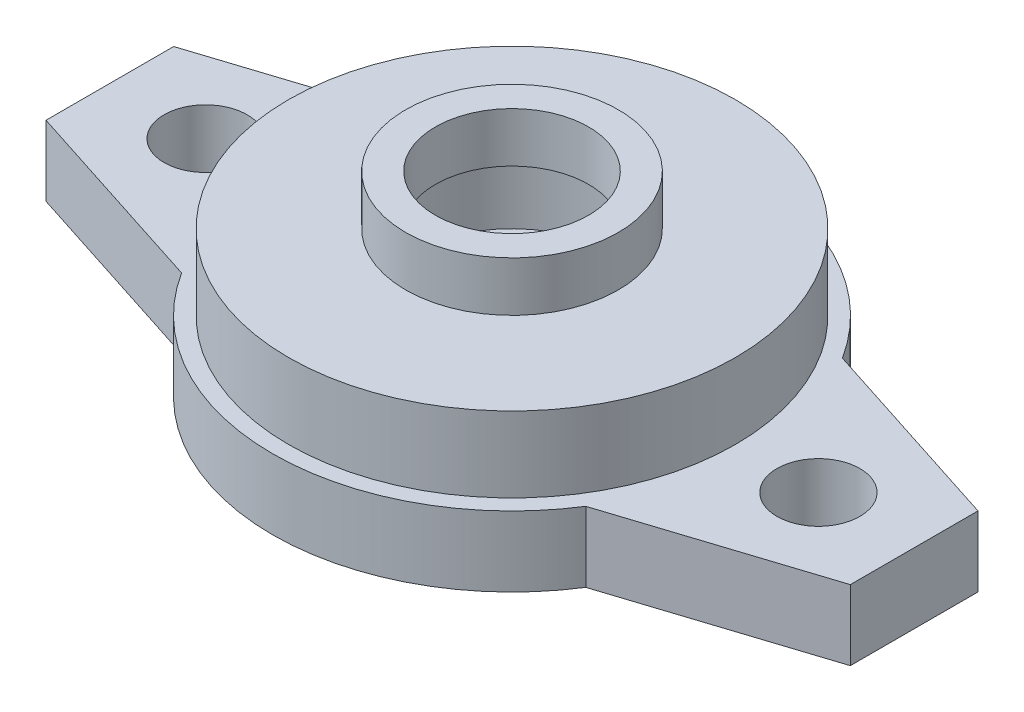
ISO-10303-21;
HEADER;
FILE_DESCRIPTION(('STEP AP214'),'2;1');
FILE_NAME('part.step','',(''),(''),'','','');
FILE_SCHEMA(('AUTOMOTIVE_DESIGN { 1 0 10303 214 1 1 1 1 }'));
ENDSEC;
DATA;
#1=APPLICATION_CONTEXT('core data for automotive mechanical design processes');
#2=APPLICATION_PROTOCOL_DEFINITION('international standard','automotive_design',2000,#1);
#3=PRODUCT_CONTEXT('',#1,'mechanical');
#4=PRODUCT('Part','Part','',(#3));
#5=PRODUCT_RELATED_PRODUCT_CATEGORY('part','',(#4));
#6=PRODUCT_DEFINITION_FORMATION('','',#4);
#7=PRODUCT_DEFINITION_CONTEXT('part definition',#1,'design');
#8=PRODUCT_DEFINITION('design','',#6,#7);
#9=PRODUCT_DEFINITION_SHAPE('','',#8);
#10=(LENGTH_UNIT() NAMED_UNIT(*) SI_UNIT(.MILLI.,.METRE.));
#11=(NAMED_UNIT(*) PLANE_ANGLE_UNIT() SI_UNIT($,.RADIAN.));
#12=(NAMED_UNIT(*) SI_UNIT($,.STERADIAN.) SOLID_ANGLE_UNIT());
#13=UNCERTAINTY_MEASURE_WITH_UNIT(LENGTH_MEASURE(1.E-05),#10,'distance_accuracy_value','');
#14=(GEOMETRIC_REPRESENTATION_CONTEXT(3) GLOBAL_UNCERTAINTY_ASSIGNED_CONTEXT((#13)) GLOBAL_UNIT_ASSIGNED_CONTEXT((#10,
#11,#12)) REPRESENTATION_CONTEXT('',''));
#15=CARTESIAN_POINT('',(0.,0.,0.));
#16=DIRECTION('',(0.,0.,1.));
#17=DIRECTION('',(1.,0.,0.));
#18=AXIS2_PLACEMENT_3D('',#15,#16,#17);
#19=CARTESIAN_POINT('',(0.,15.3,0.));
#20=DIRECTION('',(0.,1.,0.));
#21=DIRECTION('',(0.,0.,1.));
#22=AXIS2_PLACEMENT_3D('',#19,#20,#21);
#23=PLANE('',#22);
#24=CARTESIAN_POINT('',(0.,15.3,0.));
#25=DIRECTION('',(0.,1.,0.));
#26=DIRECTION('',(0.,0.,1.));
#27=AXIS2_PLACEMENT_3D('',#24,#25,#26);
#28=CIRCLE('',#27,8.33);
#29=CARTESIAN_POINT('',(0.,15.3,8.33));
#30=VERTEX_POINT('',#29);
#31=EDGE_CURVE('E11',#30,#30,#28,.T.);
#32=ORIENTED_EDGE('',*,*,#31,.T.);
#33=EDGE_LOOP('',(#32));
#34=FACE_BOUND('',#33,.T.);
#35=CARTESIAN_POINT('',(0.,15.3,0.));
#36=DIRECTION('',(0.,1.,0.));
#37=DIRECTION('',(0.,0.,1.));
#38=AXIS2_PLACEMENT_3D('',#35,#36,#37);
#39=CIRCLE('',#38,6.);
#40=CARTESIAN_POINT('',(0.,15.3,6.));
#41=VERTEX_POINT('',#40);
#42=EDGE_CURVE('E54',#41,#41,#39,.T.);
#43=ORIENTED_EDGE('',*,*,#42,.F.);
#44=EDGE_LOOP('',(#43));
#45=FACE_BOUND('',#44,.T.);
#46=ADVANCED_FACE('F43',(#34,#45),#23,.T.);
#47=CARTESIAN_POINT('',(0.,11.4,0.));
#48=DIRECTION('',(0.,1.,0.));
#49=DIRECTION('',(0.,0.,1.));
#50=AXIS2_PLACEMENT_3D('',#47,#48,#49);
#51=PLANE('',#50);
#52=CARTESIAN_POINT('',(0.,11.4,0.));
#53=DIRECTION('',(0.,1.,0.));
#54=DIRECTION('',(0.,0.,1.));
#55=AXIS2_PLACEMENT_3D('',#52,#53,#54);
#56=CIRCLE('',#55,8.33);
#57=CARTESIAN_POINT('',(0.,11.4,8.33));
#58=VERTEX_POINT('',#57);
#59=EDGE_CURVE('E47',#58,#58,#56,.T.);
#60=ORIENTED_EDGE('',*,*,#59,.F.);
#61=EDGE_LOOP('',(#60));
#62=FACE_BOUND('',#61,.T.);
#63=CARTESIAN_POINT('',(0.,11.4,0.));
#64=DIRECTION('',(0.,1.,0.));
#65=DIRECTION('',(0.,0.,1.));
#66=AXIS2_PLACEMENT_3D('',#63,#64,#65);
#67=CIRCLE('',#66,6.);
#68=CARTESIAN_POINT('',(0.,11.4,6.));
#69=VERTEX_POINT('',#68);
#70=EDGE_CURVE('E56',#69,#69,#67,.T.);
#71=ORIENTED_EDGE('',*,*,#70,.T.);
#72=EDGE_LOOP('',(#71));
#73=FACE_BOUND('',#72,.T.);
#74=ADVANCED_FACE('F66',(#62,#73),#51,.F.);
#75=CARTESIAN_POINT('',(0.,15.3,0.));
#76=DIRECTION('',(0.,-1.,0.));
#77=DIRECTION('',(0.,0.,-1.));
#78=AXIS2_PLACEMENT_3D('',#75,#76,#77);
#79=CYLINDRICAL_SURFACE('',#78,8.33);
#80=ORIENTED_EDGE('',*,*,#31,.F.);
#81=EDGE_LOOP('',(#80));
#82=FACE_BOUND('',#81,.T.);
#83=ORIENTED_EDGE('',*,*,#59,.T.);
#84=EDGE_LOOP('',(#83));
#85=FACE_BOUND('',#84,.T.);
#86=ADVANCED_FACE('F45',(#82,#85),#79,.T.);
#87=CARTESIAN_POINT('',(0.,15.3,0.));
#88=DIRECTION('',(0.,-1.,0.));
#89=DIRECTION('',(0.,0.,-1.));
#90=AXIS2_PLACEMENT_3D('',#87,#88,#89);
#91=CYLINDRICAL_SURFACE('',#90,6.);
#92=ORIENTED_EDGE('',*,*,#42,.T.);
#93=EDGE_LOOP('',(#92));
#94=FACE_BOUND('',#93,.T.);
#95=ORIENTED_EDGE('',*,*,#70,.F.);
#96=EDGE_LOOP('',(#95));
#97=FACE_BOUND('',#96,.T.);
#98=ADVANCED_FACE('F62',(#94,#97),#91,.F.);
#99=CLOSED_SHELL('',(#46,#74,#86,#98));
#100=MANIFOLD_SOLID_BREP('B2',#99);
#101=CARTESIAN_POINT('',(0.,5.5,0.));
#102=DIRECTION('',(0.,1.,0.));
#103=DIRECTION('',(0.,0.,1.));
#104=AXIS2_PLACEMENT_3D('',#101,#102,#103);
#105=PLANE('',#104);
#106=CARTESIAN_POINT('',(0.,5.5,0.));
#107=DIRECTION('',(0.,1.,0.));
#108=DIRECTION('',(0.,0.,1.));
#109=AXIS2_PLACEMENT_3D('',#106,#107,#108);
#110=CIRCLE('',#109,6.);
#111=CARTESIAN_POINT('',(0.,5.5,6.));
#112=VERTEX_POINT('',#111);
#113=EDGE_CURVE('E233',#112,#112,#110,.T.);
#114=ORIENTED_EDGE('',*,*,#113,.F.);
#115=EDGE_LOOP('',(#114));
#116=FACE_BOUND('',#115,.T.);
#117=CARTESIAN_POINT('',(0.,5.5,0.));
#118=DIRECTION('',(0.,1.,0.));
#119=DIRECTION('',(0.,0.,1.));
#120=AXIS2_PLACEMENT_3D('',#117,#118,#119);
#121=CIRCLE('',#120,8.33);
#122=CARTESIAN_POINT('',(0.,5.5,8.33));
#123=VERTEX_POINT('',#122);
#124=EDGE_CURVE('E41',#123,#123,#121,.F.);
#125=ORIENTED_EDGE('',*,*,#124,.F.);
#126=EDGE_LOOP('',(#125));
#127=FACE_BOUND('',#126,.T.);
#128=ADVANCED_FACE('F105',(#116,#127),#105,.T.);
#129=CARTESIAN_POINT('',(0.,5.5,0.));
#130=DIRECTION('',(0.,-1.,0.));
#131=DIRECTION('',(0.,0.,-1.));
#132=AXIS2_PLACEMENT_3D('',#129,#130,#131);
#133=CYLINDRICAL_SURFACE('',#132,18.75);
#134=CARTESIAN_POINT('',(0.,0.,0.));
#135=DIRECTION('',(0.,1.,0.));
#136=DIRECTION('',(0.,0.,1.));
#137=AXIS2_PLACEMENT_3D('',#134,#135,#136);
#138=CIRCLE('',#137,18.75);
#139=CARTESIAN_POINT('',(-15.8290871499275,0.,10.05));
#140=VERTEX_POINT('',#139);
#141=CARTESIAN_POINT('',(15.8290871499275,0.,10.05));
#142=VERTEX_POINT('',#141);
#143=EDGE_CURVE('E210',#140,#142,#138,.T.);
#144=ORIENTED_EDGE('',*,*,#143,.T.);
#145=DIRECTION('',(0.,-1.,0.));
#146=VECTOR('',#145,1.);
#147=CARTESIAN_POINT('',(15.8290871499275,5.5,10.05));
#148=LINE('',#147,#146);
#149=CARTESIAN_POINT('',(15.8290871499275,5.5,10.05));
#150=VERTEX_POINT('',#149);
#151=EDGE_CURVE('E114',#150,#142,#148,.T.);
#152=ORIENTED_EDGE('',*,*,#151,.F.);
#153=CARTESIAN_POINT('',(0.,5.5,0.));
#154=DIRECTION('',(0.,1.,0.));
#155=DIRECTION('',(0.,0.,1.));
#156=AXIS2_PLACEMENT_3D('',#153,#154,#155);
#157=CIRCLE('',#156,18.75);
#158=CARTESIAN_POINT('',(-15.8290871499275,5.5,10.05));
#159=VERTEX_POINT('',#158);
#160=EDGE_CURVE('E159',#159,#150,#157,.T.);
#161=ORIENTED_EDGE('',*,*,#160,.F.);
#162=DIRECTION('',(0.,-1.,0.));
#163=VECTOR('',#162,1.);
#164=CARTESIAN_POINT('',(-15.8290871499275,5.5,10.05));
#165=LINE('',#164,#163);
#166=EDGE_CURVE('E206',#159,#140,#165,.T.);
#167=ORIENTED_EDGE('',*,*,#166,.T.);
#168=EDGE_LOOP('',(#144,#152,#161,#167));
#169=FACE_BOUND('',#168,.T.);
#170=ADVANCED_FACE('F250',(#169),#133,.T.);
#171=CARTESIAN_POINT('',(4.42311958537457,5.5,13.7256082272977));
#172=DIRECTION('',(0.306720378865368,0.,0.951799668621861));
#173=DIRECTION('',(0.951799668621861,0.,-0.306720378865368));
#174=AXIS2_PLACEMENT_3D('',#171,#172,#173);
#175=PLANE('',#174);
#176=DIRECTION('',(-0.951799668621861,0.,0.306720378865368));
#177=VECTOR('',#176,1.);
#178=CARTESIAN_POINT('',(4.42311958537457,0.,13.7256082272977));
#179=LINE('',#178,#177);
#180=CARTESIAN_POINT('',(31.5,0.,5.));
#181=VERTEX_POINT('',#180);
#182=EDGE_CURVE('E214',#181,#142,#179,.T.);
#183=ORIENTED_EDGE('',*,*,#182,.F.);
#184=DIRECTION('',(0.,-1.,0.));
#185=VECTOR('',#184,1.);
#186=CARTESIAN_POINT('',(31.5,5.5,5.));
#187=LINE('',#186,#185);
#188=CARTESIAN_POINT('',(31.5,5.5,5.));
#189=VERTEX_POINT('',#188);
#190=EDGE_CURVE('E242',#189,#181,#187,.T.);
#191=ORIENTED_EDGE('',*,*,#190,.F.);
#192=DIRECTION('',(-0.951799668621861,0.,0.306720378865368));
#193=VECTOR('',#192,1.);
#194=CARTESIAN_POINT('',(4.42311958537457,5.5,13.7256082272977));
#195=LINE('',#194,#193);
#196=EDGE_CURVE('E247',#189,#150,#195,.T.);
#197=ORIENTED_EDGE('',*,*,#196,.T.);
#198=ORIENTED_EDGE('',*,*,#151,.T.);
#199=EDGE_LOOP('',(#183,#191,#197,#198));
#200=FACE_BOUND('',#199,.T.);
#201=ADVANCED_FACE('F246',(#200),#175,.T.);
#202=CARTESIAN_POINT('',(31.5,5.5,0.));
#203=DIRECTION('',(1.,0.,0.));
#204=DIRECTION('',(0.,0.,-1.));
#205=AXIS2_PLACEMENT_3D('',#202,#203,#204);
#206=PLANE('',#205);
#207=DIRECTION('',(0.,0.,1.));
#208=VECTOR('',#207,1.);
#209=CARTESIAN_POINT('',(31.5,0.,0.));
#210=LINE('',#209,#208);
#211=CARTESIAN_POINT('',(31.5,0.,-5.));
#212=VERTEX_POINT('',#211);
#213=EDGE_CURVE('E218',#212,#181,#210,.T.);
#214=ORIENTED_EDGE('',*,*,#213,.F.);
#215=DIRECTION('',(0.,-1.,0.));
#216=VECTOR('',#215,1.);
#217=CARTESIAN_POINT('',(31.5,5.5,-5.));
#218=LINE('',#217,#216);
#219=CARTESIAN_POINT('',(31.5,5.5,-5.));
#220=VERTEX_POINT('',#219);
#221=EDGE_CURVE('E240',#220,#212,#218,.T.);
#222=ORIENTED_EDGE('',*,*,#221,.F.);
#223=DIRECTION('',(0.,0.,1.));
#224=VECTOR('',#223,1.);
#225=CARTESIAN_POINT('',(31.5,5.5,0.));
#226=LINE('',#225,#224);
#227=EDGE_CURVE('E262',#220,#189,#226,.T.);
#228=ORIENTED_EDGE('',*,*,#227,.T.);
#229=ORIENTED_EDGE('',*,*,#190,.T.);
#230=EDGE_LOOP('',(#214,#222,#228,#229));
#231=FACE_BOUND('',#230,.T.);
#232=ADVANCED_FACE('F258',(#231),#206,.T.);
#233=CARTESIAN_POINT('',(4.42311958537457,5.5,-13.7256082272977));
#234=DIRECTION('',(-0.306720378865368,0.,0.951799668621861));
#235=DIRECTION('',(0.951799668621861,0.,0.306720378865368));
#236=AXIS2_PLACEMENT_3D('',#233,#234,#235);
#237=PLANE('',#236);
#238=DIRECTION('',(-0.951799668621861,0.,-0.306720378865368));
#239=VECTOR('',#238,1.);
#240=CARTESIAN_POINT('',(4.42311958537457,0.,-13.7256082272977));
#241=LINE('',#240,#239);
#242=CARTESIAN_POINT('',(15.8290871499275,0.,-10.05));
#243=VERTEX_POINT('',#242);
#244=EDGE_CURVE('E221',#212,#243,#241,.T.);
#245=ORIENTED_EDGE('',*,*,#244,.T.);
#246=DIRECTION('',(0.,-1.,0.));
#247=VECTOR('',#246,1.);
#248=CARTESIAN_POINT('',(15.8290871499275,5.5,-10.05));
#249=LINE('',#248,#247);
#250=CARTESIAN_POINT('',(15.8290871499275,5.5,-10.05));
#251=VERTEX_POINT('',#250);
#252=EDGE_CURVE('E237',#251,#243,#249,.T.);
#253=ORIENTED_EDGE('',*,*,#252,.F.);
#254=DIRECTION('',(-0.951799668621861,0.,-0.306720378865368));
#255=VECTOR('',#254,1.);
#256=CARTESIAN_POINT('',(4.42311958537457,5.5,-13.7256082272977));
#257=LINE('',#256,#255);
#258=EDGE_CURVE('E264',#220,#251,#257,.T.);
#259=ORIENTED_EDGE('',*,*,#258,.F.);
#260=ORIENTED_EDGE('',*,*,#221,.T.);
#261=EDGE_LOOP('',(#245,#253,#259,#260));
#262=FACE_BOUND('',#261,.T.);
#263=ADVANCED_FACE('F270',(#262),#237,.F.);
#264=CARTESIAN_POINT('',(-15.8290871499275,0.,-10.05));
#265=VERTEX_POINT('',#264);
#266=EDGE_CURVE('E215',#243,#265,#138,.T.);
#267=ORIENTED_EDGE('',*,*,#266,.T.);
#268=DIRECTION('',(0.,-1.,0.));
#269=VECTOR('',#268,1.);
#270=CARTESIAN_POINT('',(-15.8290871499275,5.5,-10.05));
#271=LINE('',#270,#269);
#272=CARTESIAN_POINT('',(-15.8290871499275,5.5,-10.05));
#273=VERTEX_POINT('',#272);
#274=EDGE_CURVE('E186',#273,#265,#271,.T.);
#275=ORIENTED_EDGE('',*,*,#274,.F.);
#276=EDGE_CURVE('E192',#251,#273,#157,.T.);
#277=ORIENTED_EDGE('',*,*,#276,.F.);
#278=ORIENTED_EDGE('',*,*,#252,.T.);
#279=EDGE_LOOP('',(#267,#275,#277,#278));
#280=FACE_BOUND('',#279,.T.);
#281=ADVANCED_FACE('F273',(#280),#133,.T.);
#282=CARTESIAN_POINT('',(-4.42311958537457,5.5,-13.7256082272977));
#283=DIRECTION('',(-0.306720378865368,0.,-0.951799668621861));
#284=DIRECTION('',(-0.951799668621861,0.,0.306720378865368));
#285=AXIS2_PLACEMENT_3D('',#282,#283,#284);
#286=PLANE('',#285);
#287=DIRECTION('',(0.951799668621861,0.,-0.306720378865368));
#288=VECTOR('',#287,1.);
#289=CARTESIAN_POINT('',(-4.42311958537457,0.,-13.7256082272977));
#290=LINE('',#289,#288);
#291=CARTESIAN_POINT('',(-31.5,0.,-5.));
#292=VERTEX_POINT('',#291);
#293=EDGE_CURVE('E181',#292,#265,#290,.T.);
#294=ORIENTED_EDGE('',*,*,#293,.F.);
#295=DIRECTION('',(0.,-1.,0.));
#296=VECTOR('',#295,1.);
#297=CARTESIAN_POINT('',(-31.5,5.5,-5.));
#298=LINE('',#297,#296);
#299=CARTESIAN_POINT('',(-31.5,5.5,-5.));
#300=VERTEX_POINT('',#299);
#301=EDGE_CURVE('E176',#300,#292,#298,.T.);
#302=ORIENTED_EDGE('',*,*,#301,.F.);
#303=DIRECTION('',(0.951799668621861,0.,-0.306720378865368));
#304=VECTOR('',#303,1.);
#305=CARTESIAN_POINT('',(-4.42311958537457,5.5,-13.7256082272977));
#306=LINE('',#305,#304);
#307=EDGE_CURVE('E179',#300,#273,#306,.T.);
#308=ORIENTED_EDGE('',*,*,#307,.T.);
#309=ORIENTED_EDGE('',*,*,#274,.T.);
#310=EDGE_LOOP('',(#294,#302,#308,#309));
#311=FACE_BOUND('',#310,.T.);
#312=ADVANCED_FACE('F178',(#311),#286,.T.);
#313=CARTESIAN_POINT('',(-31.5,5.5,0.));
#314=DIRECTION('',(-1.,0.,0.));
#315=DIRECTION('',(0.,0.,1.));
#316=AXIS2_PLACEMENT_3D('',#313,#314,#315);
#317=PLANE('',#316);
#318=DIRECTION('',(0.,0.,-1.));
#319=VECTOR('',#318,1.);
#320=CARTESIAN_POINT('',(-31.5,0.,0.));
#321=LINE('',#320,#319);
#322=CARTESIAN_POINT('',(-31.5,0.,5.));
#323=VERTEX_POINT('',#322);
#324=EDGE_CURVE('E224',#323,#292,#321,.T.);
#325=ORIENTED_EDGE('',*,*,#324,.F.);
#326=DIRECTION('',(0.,-1.,0.));
#327=VECTOR('',#326,1.);
#328=CARTESIAN_POINT('',(-31.5,5.5,5.));
#329=LINE('',#328,#327);
#330=CARTESIAN_POINT('',(-31.5,5.5,5.));
#331=VERTEX_POINT('',#330);
#332=EDGE_CURVE('E150',#331,#323,#329,.T.);
#333=ORIENTED_EDGE('',*,*,#332,.F.);
#334=DIRECTION('',(0.,0.,-1.));
#335=VECTOR('',#334,1.);
#336=CARTESIAN_POINT('',(-31.5,5.5,0.));
#337=LINE('',#336,#335);
#338=EDGE_CURVE('E190',#331,#300,#337,.T.);
#339=ORIENTED_EDGE('',*,*,#338,.T.);
#340=ORIENTED_EDGE('',*,*,#301,.T.);
#341=EDGE_LOOP('',(#325,#333,#339,#340));
#342=FACE_BOUND('',#341,.T.);
#343=ADVANCED_FACE('F195',(#342),#317,.T.);
#344=CARTESIAN_POINT('',(-24.,5.5,0.));
#345=DIRECTION('',(0.,-1.,0.));
#346=DIRECTION('',(0.,0.,-1.));
#347=AXIS2_PLACEMENT_3D('',#344,#345,#346);
#348=CYLINDRICAL_SURFACE('',#347,3.25);
#349=CARTESIAN_POINT('',(-24.,5.5,0.));
#350=DIRECTION('',(0.,1.,0.));
#351=DIRECTION('',(0.,0.,1.));
#352=AXIS2_PLACEMENT_3D('',#349,#350,#351);
#353=CIRCLE('',#352,3.25);
#354=CARTESIAN_POINT('',(-24.,5.5,3.25));
#355=VERTEX_POINT('',#354);
#356=EDGE_CURVE('E197',#355,#355,#353,.F.);
#357=ORIENTED_EDGE('',*,*,#356,.F.);
#358=EDGE_LOOP('',(#357));
#359=FACE_BOUND('',#358,.T.);
#360=CARTESIAN_POINT('',(-24.,0.,0.));
#361=DIRECTION('',(0.,1.,0.));
#362=DIRECTION('',(0.,0.,1.));
#363=AXIS2_PLACEMENT_3D('',#360,#361,#362);
#364=CIRCLE('',#363,3.25);
#365=CARTESIAN_POINT('',(-24.,0.,3.25));
#366=VERTEX_POINT('',#365);
#367=EDGE_CURVE('E227',#366,#366,#364,.F.);
#368=ORIENTED_EDGE('',*,*,#367,.T.);
#369=EDGE_LOOP('',(#368));
#370=FACE_BOUND('',#369,.T.);
#371=ADVANCED_FACE('F322',(#359,#370),#348,.F.);
#372=CARTESIAN_POINT('',(-4.42311958537457,5.5,13.7256082272977));
#373=DIRECTION('',(0.306720378865368,0.,-0.951799668621861));
#374=DIRECTION('',(-0.951799668621861,0.,-0.306720378865368));
#375=AXIS2_PLACEMENT_3D('',#372,#373,#374);
#376=PLANE('',#375);
#377=DIRECTION('',(0.951799668621861,0.,0.306720378865368));
#378=VECTOR('',#377,1.);
#379=CARTESIAN_POINT('',(-4.42311958537457,0.,13.7256082272977));
#380=LINE('',#379,#378);
#381=EDGE_CURVE('E153',#323,#140,#380,.T.);
#382=ORIENTED_EDGE('',*,*,#381,.T.);
#383=ORIENTED_EDGE('',*,*,#166,.F.);
#384=DIRECTION('',(0.951799668621861,0.,0.306720378865368));
#385=VECTOR('',#384,1.);
#386=CARTESIAN_POINT('',(-4.42311958537457,5.5,13.7256082272977));
#387=LINE('',#386,#385);
#388=EDGE_CURVE('E122',#331,#159,#387,.T.);
#389=ORIENTED_EDGE('',*,*,#388,.F.);
#390=ORIENTED_EDGE('',*,*,#332,.T.);
#391=EDGE_LOOP('',(#382,#383,#389,#390));
#392=FACE_BOUND('',#391,.T.);
#393=ADVANCED_FACE('F317',(#392),#376,.F.);
#394=CARTESIAN_POINT('',(0.,5.5,0.));
#395=DIRECTION('',(0.,-1.,0.));
#396=DIRECTION('',(0.,0.,-1.));
#397=AXIS2_PLACEMENT_3D('',#394,#395,#396);
#398=CYLINDRICAL_SURFACE('',#397,6.);
#399=ORIENTED_EDGE('',*,*,#113,.T.);
#400=EDGE_LOOP('',(#399));
#401=FACE_BOUND('',#400,.T.);
#402=CARTESIAN_POINT('',(0.,0.,0.));
#403=DIRECTION('',(0.,1.,0.));
#404=DIRECTION('',(0.,0.,1.));
#405=AXIS2_PLACEMENT_3D('',#402,#403,#404);
#406=CIRCLE('',#405,6.);
#407=CARTESIAN_POINT('',(0.,0.,6.));
#408=VERTEX_POINT('',#407);
#409=EDGE_CURVE('E207',#408,#408,#406,.T.);
#410=ORIENTED_EDGE('',*,*,#409,.F.);
#411=EDGE_LOOP('',(#410));
#412=FACE_BOUND('',#411,.T.);
#413=ADVANCED_FACE('F107',(#401,#412),#398,.F.);
#414=CARTESIAN_POINT('',(24.,5.5,0.));
#415=DIRECTION('',(0.,-1.,0.));
#416=DIRECTION('',(0.,0.,-1.));
#417=AXIS2_PLACEMENT_3D('',#414,#415,#416);
#418=CYLINDRICAL_SURFACE('',#417,3.25);
#419=CARTESIAN_POINT('',(24.,5.5,0.));
#420=DIRECTION('',(0.,1.,0.));
#421=DIRECTION('',(0.,0.,1.));
#422=AXIS2_PLACEMENT_3D('',#419,#420,#421);
#423=CIRCLE('',#422,3.25);
#424=CARTESIAN_POINT('',(24.,5.5,3.25));
#425=VERTEX_POINT('',#424);
#426=EDGE_CURVE('E203',#425,#425,#423,.T.);
#427=ORIENTED_EDGE('',*,*,#426,.T.);
#428=EDGE_LOOP('',(#427));
#429=FACE_BOUND('',#428,.T.);
#430=CARTESIAN_POINT('',(24.,0.,0.));
#431=DIRECTION('',(0.,1.,0.));
#432=DIRECTION('',(0.,0.,1.));
#433=AXIS2_PLACEMENT_3D('',#430,#431,#432);
#434=CIRCLE('',#433,3.25);
#435=CARTESIAN_POINT('',(24.,0.,3.25));
#436=VERTEX_POINT('',#435);
#437=EDGE_CURVE('E230',#436,#436,#434,.T.);
#438=ORIENTED_EDGE('',*,*,#437,.F.);
#439=EDGE_LOOP('',(#438));
#440=FACE_BOUND('',#439,.T.);
#441=ADVANCED_FACE('F293',(#429,#440),#418,.F.);
#442=CARTESIAN_POINT('',(0.,5.5,0.));
#443=DIRECTION('',(0.,1.,0.));
#444=DIRECTION('',(0.,0.,1.));
#445=AXIS2_PLACEMENT_3D('',#442,#443,#444);
#446=CIRCLE('',#445,17.5);
#447=CARTESIAN_POINT('',(0.,5.5,17.5));
#448=VERTEX_POINT('',#447);
#449=EDGE_CURVE('E305',#448,#448,#446,.T.);
#450=ORIENTED_EDGE('',*,*,#449,.F.);
#451=EDGE_LOOP('',(#450));
#452=FACE_BOUND('',#451,.T.);
#453=ORIENTED_EDGE('',*,*,#160,.T.);
#454=ORIENTED_EDGE('',*,*,#196,.F.);
#455=ORIENTED_EDGE('',*,*,#227,.F.);
#456=ORIENTED_EDGE('',*,*,#258,.T.);
#457=ORIENTED_EDGE('',*,*,#276,.T.);
#458=ORIENTED_EDGE('',*,*,#307,.F.);
#459=ORIENTED_EDGE('',*,*,#338,.F.);
#460=ORIENTED_EDGE('',*,*,#388,.T.);
#461=EDGE_LOOP('',(#453,#454,#455,#456,#457,#458,#459,#460));
#462=FACE_BOUND('',#461,.T.);
#463=ORIENTED_EDGE('',*,*,#356,.T.);
#464=EDGE_LOOP('',(#463));
#465=FACE_BOUND('',#464,.T.);
#466=ORIENTED_EDGE('',*,*,#426,.F.);
#467=EDGE_LOOP('',(#466));
#468=FACE_BOUND('',#467,.T.);
#469=ADVANCED_FACE('F188',(#452,#462,#465,#468),#105,.T.);
#470=CARTESIAN_POINT('',(0.,0.,0.));
#471=DIRECTION('',(0.,1.,0.));
#472=DIRECTION('',(0.,0.,1.));
#473=AXIS2_PLACEMENT_3D('',#470,#471,#472);
#474=PLANE('',#473);
#475=ORIENTED_EDGE('',*,*,#409,.T.);
#476=EDGE_LOOP('',(#475));
#477=FACE_BOUND('',#476,.T.);
#478=ORIENTED_EDGE('',*,*,#143,.F.);
#479=ORIENTED_EDGE('',*,*,#381,.F.);
#480=ORIENTED_EDGE('',*,*,#324,.T.);
#481=ORIENTED_EDGE('',*,*,#293,.T.);
#482=ORIENTED_EDGE('',*,*,#266,.F.);
#483=ORIENTED_EDGE('',*,*,#244,.F.);
#484=ORIENTED_EDGE('',*,*,#213,.T.);
#485=ORIENTED_EDGE('',*,*,#182,.T.);
#486=EDGE_LOOP('',(#478,#479,#480,#481,#482,#483,#484,#485));
#487=FACE_BOUND('',#486,.T.);
#488=ORIENTED_EDGE('',*,*,#367,.F.);
#489=EDGE_LOOP('',(#488));
#490=FACE_BOUND('',#489,.T.);
#491=ORIENTED_EDGE('',*,*,#437,.T.);
#492=EDGE_LOOP('',(#491));
#493=FACE_BOUND('',#492,.T.);
#494=ADVANCED_FACE('F252',(#477,#487,#490,#493),#474,.F.);
#495=CARTESIAN_POINT('',(0.,11.4,0.));
#496=DIRECTION('',(0.,1.,0.));
#497=DIRECTION('',(0.,0.,1.));
#498=AXIS2_PLACEMENT_3D('',#495,#496,#497);
#499=PLANE('',#498);
#500=CARTESIAN_POINT('',(0.,11.4,0.));
#501=DIRECTION('',(0.,1.,0.));
#502=DIRECTION('',(0.,0.,1.));
#503=AXIS2_PLACEMENT_3D('',#500,#501,#502);
#504=CIRCLE('',#503,17.5);
#505=CARTESIAN_POINT('',(0.,11.4,17.5));
#506=VERTEX_POINT('',#505);
#507=EDGE_CURVE('E211',#506,#506,#504,.T.);
#508=ORIENTED_EDGE('',*,*,#507,.T.);
#509=EDGE_LOOP('',(#508));
#510=FACE_BOUND('',#509,.T.);
#511=CARTESIAN_POINT('',(0.,11.4,0.));
#512=DIRECTION('',(0.,1.,0.));
#513=DIRECTION('',(0.,0.,1.));
#514=AXIS2_PLACEMENT_3D('',#511,#512,#513);
#515=CIRCLE('',#514,8.33);
#516=CARTESIAN_POINT('',(0.,11.4,8.33));
#517=VERTEX_POINT('',#516);
#518=EDGE_CURVE('E307',#517,#517,#515,.T.);
#519=ORIENTED_EDGE('',*,*,#518,.F.);
#520=EDGE_LOOP('',(#519));
#521=FACE_BOUND('',#520,.T.);
#522=ADVANCED_FACE('F299',(#510,#521),#499,.T.);
#523=CARTESIAN_POINT('',(0.,11.4,0.));
#524=DIRECTION('',(0.,-1.,0.));
#525=DIRECTION('',(0.,0.,-1.));
#526=AXIS2_PLACEMENT_3D('',#523,#524,#525);
#527=CYLINDRICAL_SURFACE('',#526,17.5);
#528=ORIENTED_EDGE('',*,*,#507,.F.);
#529=EDGE_LOOP('',(#528));
#530=FACE_BOUND('',#529,.T.);
#531=ORIENTED_EDGE('',*,*,#449,.T.);
#532=EDGE_LOOP('',(#531));
#533=FACE_BOUND('',#532,.T.);
#534=ADVANCED_FACE('F382',(#530,#533),#527,.T.);
#535=CARTESIAN_POINT('',(0.,11.4,0.));
#536=DIRECTION('',(0.,-1.,0.));
#537=DIRECTION('',(0.,0.,-1.));
#538=AXIS2_PLACEMENT_3D('',#535,#536,#537);
#539=CYLINDRICAL_SURFACE('',#538,8.33);
#540=ORIENTED_EDGE('',*,*,#518,.T.);
#541=EDGE_LOOP('',(#540));
#542=FACE_BOUND('',#541,.T.);
#543=ORIENTED_EDGE('',*,*,#124,.T.);
#544=EDGE_LOOP('',(#543));
#545=FACE_BOUND('',#544,.T.);
#546=ADVANCED_FACE('F392',(#542,#545),#539,.F.);
#547=CLOSED_SHELL('',(#128,#170,#201,#232,#263,#281,#312,#343,#371,#393,#413,#441,#469,#494,
#522,#534,#546));
#548=MANIFOLD_SOLID_BREP('B6',#547);
#549=ADVANCED_BREP_SHAPE_REPRESENTATION('',(#18,#100,#548),#14);
#550=SHAPE_DEFINITION_REPRESENTATION(#9,#549);
ENDSEC;
END-ISO-10303-21;
